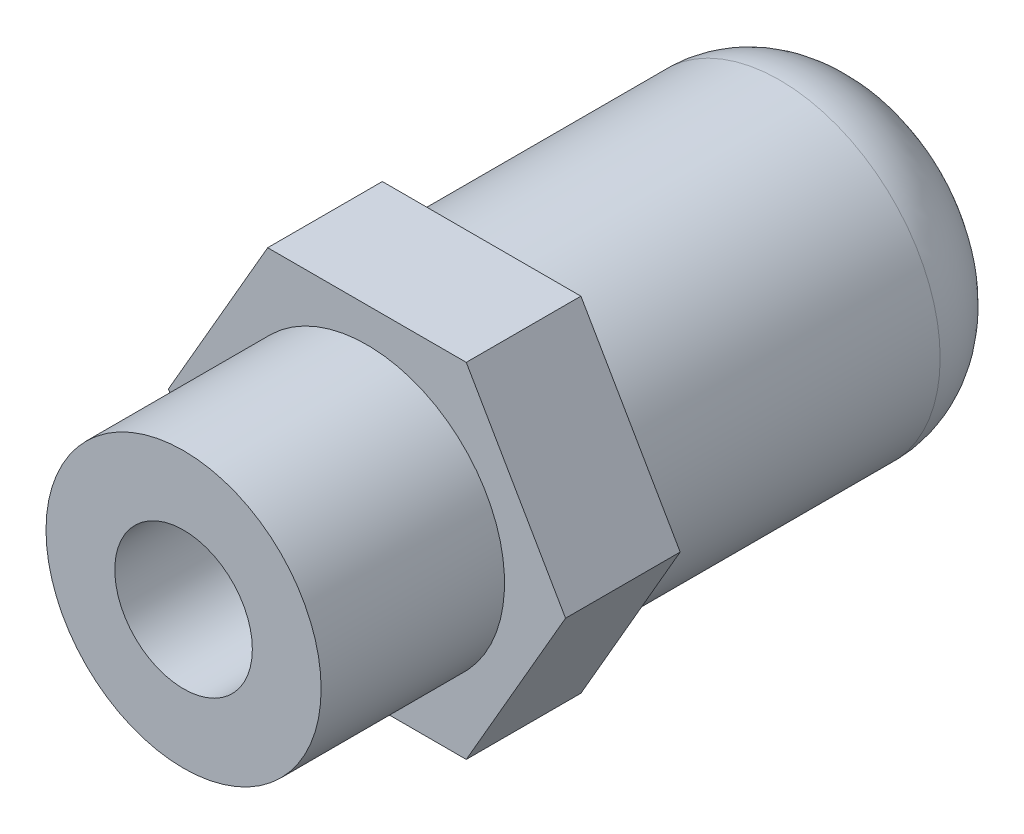
ISO-10303-21;
HEADER;
FILE_DESCRIPTION(('STEP AP214'),'2;1');
FILE_NAME('part.step','',(''),(''),'','','');
FILE_SCHEMA(('AUTOMOTIVE_DESIGN { 1 0 10303 214 1 1 1 1 }'));
ENDSEC;
DATA;
#1=APPLICATION_CONTEXT('core data for automotive mechanical design processes');
#2=APPLICATION_PROTOCOL_DEFINITION('international standard','automotive_design',2000,#1);
#3=PRODUCT_CONTEXT('',#1,'mechanical');
#4=PRODUCT('Part','Part','',(#3));
#5=PRODUCT_RELATED_PRODUCT_CATEGORY('part','',(#4));
#6=PRODUCT_DEFINITION_FORMATION('','',#4);
#7=PRODUCT_DEFINITION_CONTEXT('part definition',#1,'design');
#8=PRODUCT_DEFINITION('design','',#6,#7);
#9=PRODUCT_DEFINITION_SHAPE('','',#8);
#10=(LENGTH_UNIT() NAMED_UNIT(*) SI_UNIT(.MILLI.,.METRE.));
#11=(NAMED_UNIT(*) PLANE_ANGLE_UNIT() SI_UNIT($,.RADIAN.));
#12=(NAMED_UNIT(*) SI_UNIT($,.STERADIAN.) SOLID_ANGLE_UNIT());
#13=UNCERTAINTY_MEASURE_WITH_UNIT(LENGTH_MEASURE(1.E-05),#10,'distance_accuracy_value','');
#14=(GEOMETRIC_REPRESENTATION_CONTEXT(3) GLOBAL_UNCERTAINTY_ASSIGNED_CONTEXT((#13)) GLOBAL_UNIT_ASSIGNED_CONTEXT((#10,
#11,#12)) REPRESENTATION_CONTEXT('',''));
#15=CARTESIAN_POINT('',(0.,0.,0.));
#16=DIRECTION('',(0.,0.,1.));
#17=DIRECTION('',(1.,0.,0.));
#18=AXIS2_PLACEMENT_3D('',#15,#16,#17);
#19=CARTESIAN_POINT('',(0.,0.,8.));
#20=DIRECTION('',(0.,0.,-1.));
#21=DIRECTION('',(-1.,0.,0.));
#22=AXIS2_PLACEMENT_3D('',#19,#20,#21);
#23=CYLINDRICAL_SURFACE('',#22,6.);
#24=CARTESIAN_POINT('',(0.,0.,8.));
#25=DIRECTION('',(0.,0.,1.));
#26=DIRECTION('',(1.,0.,0.));
#27=AXIS2_PLACEMENT_3D('',#24,#25,#26);
#28=CIRCLE('',#27,6.);
#29=CARTESIAN_POINT('',(6.,0.,8.));
#30=VERTEX_POINT('',#29);
#31=EDGE_CURVE('E44',#30,#30,#28,.T.);
#32=ORIENTED_EDGE('',*,*,#31,.F.);
#33=EDGE_LOOP('',(#32));
#34=FACE_BOUND('',#33,.T.);
#35=CARTESIAN_POINT('',(0.,0.,0.));
#36=DIRECTION('',(0.,0.,-1.));
#37=DIRECTION('',(-1.,0.,0.));
#38=AXIS2_PLACEMENT_3D('',#35,#36,#37);
#39=CIRCLE('',#38,6.);
#40=CARTESIAN_POINT('',(-6.,0.,0.));
#41=VERTEX_POINT('',#40);
#42=EDGE_CURVE('E141',#41,#41,#39,.T.);
#43=ORIENTED_EDGE('',*,*,#42,.F.);
#44=EDGE_LOOP('',(#43));
#45=FACE_BOUND('',#44,.T.);
#46=ADVANCED_FACE('F35',(#34,#45),#23,.T.);
#47=CARTESIAN_POINT('',(0.,0.,8.));
#48=DIRECTION('',(0.,0.,1.));
#49=DIRECTION('',(1.,0.,0.));
#50=AXIS2_PLACEMENT_3D('',#47,#48,#49);
#51=PLANE('',#50);
#52=CARTESIAN_POINT('',(0.,0.,8.));
#53=DIRECTION('',(0.,0.,1.));
#54=DIRECTION('',(1.,0.,0.));
#55=AXIS2_PLACEMENT_3D('',#52,#53,#54);
#56=CIRCLE('',#55,3.);
#57=CARTESIAN_POINT('',(3.,0.,8.));
#58=VERTEX_POINT('',#57);
#59=EDGE_CURVE('E191',#58,#58,#56,.T.);
#60=ORIENTED_EDGE('',*,*,#59,.F.);
#61=EDGE_LOOP('',(#60));
#62=FACE_BOUND('',#61,.T.);
#63=ORIENTED_EDGE('',*,*,#31,.T.);
#64=EDGE_LOOP('',(#63));
#65=FACE_BOUND('',#64,.T.);
#66=ADVANCED_FACE('F146',(#62,#65),#51,.T.);
#67=CARTESIAN_POINT('',(4.33012701892219,-7.49999999999999,-5.));
#68=DIRECTION('',(0.,1.,0.));
#69=DIRECTION('',(-1.,0.,0.));
#70=AXIS2_PLACEMENT_3D('',#67,#68,#69);
#71=PLANE('',#70);
#72=DIRECTION('',(-1.,0.,0.));
#73=VECTOR('',#72,1.);
#74=CARTESIAN_POINT('',(4.33012701892219,-7.49999999999999,0.));
#75=LINE('',#74,#73);
#76=CARTESIAN_POINT('',(4.33012701892219,-7.49999999999999,0.));
#77=VERTEX_POINT('',#76);
#78=CARTESIAN_POINT('',(-4.33012701892219,-7.49999999999999,0.));
#79=VERTEX_POINT('',#78);
#80=EDGE_CURVE('E121',#77,#79,#75,.T.);
#81=ORIENTED_EDGE('',*,*,#80,.T.);
#82=DIRECTION('',(0.,0.,1.));
#83=VECTOR('',#82,1.);
#84=CARTESIAN_POINT('',(-4.33012701892219,-7.49999999999999,-5.));
#85=LINE('',#84,#83);
#86=CARTESIAN_POINT('',(-4.33012701892219,-7.49999999999999,-5.));
#87=VERTEX_POINT('',#86);
#88=EDGE_CURVE('E139',#87,#79,#85,.T.);
#89=ORIENTED_EDGE('',*,*,#88,.F.);
#90=DIRECTION('',(-1.,0.,0.));
#91=VECTOR('',#90,1.);
#92=CARTESIAN_POINT('',(4.33012701892219,-7.49999999999999,-5.));
#93=LINE('',#92,#91);
#94=CARTESIAN_POINT('',(4.33012701892219,-7.49999999999999,-5.));
#95=VERTEX_POINT('',#94);
#96=EDGE_CURVE('E132',#95,#87,#93,.T.);
#97=ORIENTED_EDGE('',*,*,#96,.F.);
#98=DIRECTION('',(0.,0.,1.));
#99=VECTOR('',#98,1.);
#100=CARTESIAN_POINT('',(4.33012701892219,-7.49999999999999,-5.));
#101=LINE('',#100,#99);
#102=EDGE_CURVE('E117',#95,#77,#101,.T.);
#103=ORIENTED_EDGE('',*,*,#102,.T.);
#104=EDGE_LOOP('',(#81,#89,#97,#103));
#105=FACE_BOUND('',#104,.T.);
#106=ADVANCED_FACE('F161',(#105),#71,.F.);
#107=CARTESIAN_POINT('',(-4.33012701892219,-7.49999999999999,-5.));
#108=DIRECTION('',(0.866025403784439,0.5,0.));
#109=DIRECTION('',(-0.5,0.866025403784439,0.));
#110=AXIS2_PLACEMENT_3D('',#107,#108,#109);
#111=PLANE('',#110);
#112=DIRECTION('',(-0.5,0.866025403784439,0.));
#113=VECTOR('',#112,1.);
#114=CARTESIAN_POINT('',(-4.33012701892219,-7.49999999999999,0.));
#115=LINE('',#114,#113);
#116=CARTESIAN_POINT('',(-8.66025403784438,0.,0.));
#117=VERTEX_POINT('',#116);
#118=EDGE_CURVE('E124',#79,#117,#115,.T.);
#119=ORIENTED_EDGE('',*,*,#118,.T.);
#120=DIRECTION('',(0.,0.,1.));
#121=VECTOR('',#120,1.);
#122=CARTESIAN_POINT('',(-8.66025403784438,0.,-5.));
#123=LINE('',#122,#121);
#124=CARTESIAN_POINT('',(-8.66025403784438,0.,-5.));
#125=VERTEX_POINT('',#124);
#126=EDGE_CURVE('E136',#125,#117,#123,.T.);
#127=ORIENTED_EDGE('',*,*,#126,.F.);
#128=DIRECTION('',(-0.5,0.866025403784439,0.));
#129=VECTOR('',#128,1.);
#130=CARTESIAN_POINT('',(-4.33012701892219,-7.49999999999999,-5.));
#131=LINE('',#130,#129);
#132=EDGE_CURVE('E90',#87,#125,#131,.T.);
#133=ORIENTED_EDGE('',*,*,#132,.F.);
#134=ORIENTED_EDGE('',*,*,#88,.T.);
#135=EDGE_LOOP('',(#119,#127,#133,#134));
#136=FACE_BOUND('',#135,.T.);
#137=ADVANCED_FACE('F179',(#136),#111,.F.);
#138=CARTESIAN_POINT('',(-8.66025403784438,0.,-5.));
#139=DIRECTION('',(0.866025403784438,-0.5,0.));
#140=DIRECTION('',(0.5,0.866025403784438,0.));
#141=AXIS2_PLACEMENT_3D('',#138,#139,#140);
#142=PLANE('',#141);
#143=DIRECTION('',(0.5,0.866025403784438,0.));
#144=VECTOR('',#143,1.);
#145=CARTESIAN_POINT('',(-8.66025403784438,0.,0.));
#146=LINE('',#145,#144);
#147=CARTESIAN_POINT('',(-4.33012701892219,7.5,0.));
#148=VERTEX_POINT('',#147);
#149=EDGE_CURVE('E127',#117,#148,#146,.T.);
#150=ORIENTED_EDGE('',*,*,#149,.T.);
#151=DIRECTION('',(0.,0.,1.));
#152=VECTOR('',#151,1.);
#153=CARTESIAN_POINT('',(-4.33012701892219,7.5,-5.));
#154=LINE('',#153,#152);
#155=CARTESIAN_POINT('',(-4.33012701892219,7.5,-5.));
#156=VERTEX_POINT('',#155);
#157=EDGE_CURVE('E112',#156,#148,#154,.T.);
#158=ORIENTED_EDGE('',*,*,#157,.F.);
#159=DIRECTION('',(0.5,0.866025403784438,0.));
#160=VECTOR('',#159,1.);
#161=CARTESIAN_POINT('',(-8.66025403784438,0.,-5.));
#162=LINE('',#161,#160);
#163=EDGE_CURVE('E103',#125,#156,#162,.T.);
#164=ORIENTED_EDGE('',*,*,#163,.F.);
#165=ORIENTED_EDGE('',*,*,#126,.T.);
#166=EDGE_LOOP('',(#150,#158,#164,#165));
#167=FACE_BOUND('',#166,.T.);
#168=ADVANCED_FACE('F176',(#167),#142,.F.);
#169=CARTESIAN_POINT('',(-4.33012701892219,7.5,-5.));
#170=DIRECTION('',(0.,-1.,0.));
#171=DIRECTION('',(1.,0.,0.));
#172=AXIS2_PLACEMENT_3D('',#169,#170,#171);
#173=PLANE('',#172);
#174=DIRECTION('',(1.,0.,0.));
#175=VECTOR('',#174,1.);
#176=CARTESIAN_POINT('',(-4.33012701892219,7.5,0.));
#177=LINE('',#176,#175);
#178=CARTESIAN_POINT('',(4.33012701892219,7.5,0.));
#179=VERTEX_POINT('',#178);
#180=EDGE_CURVE('E111',#148,#179,#177,.T.);
#181=ORIENTED_EDGE('',*,*,#180,.T.);
#182=DIRECTION('',(0.,0.,1.));
#183=VECTOR('',#182,1.);
#184=CARTESIAN_POINT('',(4.33012701892219,7.5,-5.));
#185=LINE('',#184,#183);
#186=CARTESIAN_POINT('',(4.33012701892219,7.5,-5.));
#187=VERTEX_POINT('',#186);
#188=EDGE_CURVE('E108',#187,#179,#185,.T.);
#189=ORIENTED_EDGE('',*,*,#188,.F.);
#190=DIRECTION('',(1.,0.,0.));
#191=VECTOR('',#190,1.);
#192=CARTESIAN_POINT('',(-4.33012701892219,7.5,-5.));
#193=LINE('',#192,#191);
#194=EDGE_CURVE('E97',#156,#187,#193,.T.);
#195=ORIENTED_EDGE('',*,*,#194,.F.);
#196=ORIENTED_EDGE('',*,*,#157,.T.);
#197=EDGE_LOOP('',(#181,#189,#195,#196));
#198=FACE_BOUND('',#197,.T.);
#199=ADVANCED_FACE('F109',(#198),#173,.F.);
#200=CARTESIAN_POINT('',(4.33012701892219,7.5,-5.));
#201=DIRECTION('',(-0.866025403784439,-0.5,0.));
#202=DIRECTION('',(0.5,-0.866025403784439,0.));
#203=AXIS2_PLACEMENT_3D('',#200,#201,#202);
#204=PLANE('',#203);
#205=DIRECTION('',(0.5,-0.866025403784439,0.));
#206=VECTOR('',#205,1.);
#207=CARTESIAN_POINT('',(4.33012701892219,7.5,0.));
#208=LINE('',#207,#206);
#209=CARTESIAN_POINT('',(8.66025403784439,0.,0.));
#210=VERTEX_POINT('',#209);
#211=EDGE_CURVE('E75',#179,#210,#208,.T.);
#212=ORIENTED_EDGE('',*,*,#211,.T.);
#213=DIRECTION('',(0.,0.,1.));
#214=VECTOR('',#213,1.);
#215=CARTESIAN_POINT('',(8.66025403784439,0.,-5.));
#216=LINE('',#215,#214);
#217=CARTESIAN_POINT('',(8.66025403784439,0.,-5.));
#218=VERTEX_POINT('',#217);
#219=EDGE_CURVE('E113',#218,#210,#216,.T.);
#220=ORIENTED_EDGE('',*,*,#219,.F.);
#221=DIRECTION('',(0.5,-0.866025403784439,0.));
#222=VECTOR('',#221,1.);
#223=CARTESIAN_POINT('',(4.33012701892219,7.5,-5.));
#224=LINE('',#223,#222);
#225=EDGE_CURVE('E101',#187,#218,#224,.T.);
#226=ORIENTED_EDGE('',*,*,#225,.F.);
#227=ORIENTED_EDGE('',*,*,#188,.T.);
#228=EDGE_LOOP('',(#212,#220,#226,#227));
#229=FACE_BOUND('',#228,.T.);
#230=ADVANCED_FACE('F115',(#229),#204,.F.);
#231=CARTESIAN_POINT('',(8.66025403784439,0.,-5.));
#232=DIRECTION('',(-0.866025403784438,0.5,0.));
#233=DIRECTION('',(-0.5,-0.866025403784439,0.));
#234=AXIS2_PLACEMENT_3D('',#231,#232,#233);
#235=PLANE('',#234);
#236=DIRECTION('',(-0.5,-0.866025403784438,0.));
#237=VECTOR('',#236,1.);
#238=CARTESIAN_POINT('',(8.66025403784439,0.,0.));
#239=LINE('',#238,#237);
#240=EDGE_CURVE('E81',#210,#77,#239,.T.);
#241=ORIENTED_EDGE('',*,*,#240,.T.);
#242=ORIENTED_EDGE('',*,*,#102,.F.);
#243=DIRECTION('',(-0.5,-0.866025403784438,0.));
#244=VECTOR('',#243,1.);
#245=CARTESIAN_POINT('',(8.66025403784439,0.,-5.));
#246=LINE('',#245,#244);
#247=EDGE_CURVE('E52',#218,#95,#246,.T.);
#248=ORIENTED_EDGE('',*,*,#247,.F.);
#249=ORIENTED_EDGE('',*,*,#219,.T.);
#250=EDGE_LOOP('',(#241,#242,#248,#249));
#251=FACE_BOUND('',#250,.T.);
#252=ADVANCED_FACE('F163',(#251),#235,.F.);
#253=CARTESIAN_POINT('',(0.,0.,-5.));
#254=DIRECTION('',(0.,0.,-1.));
#255=DIRECTION('',(-1.,0.,0.));
#256=AXIS2_PLACEMENT_3D('',#253,#254,#255);
#257=PLANE('',#256);
#258=CARTESIAN_POINT('',(0.,0.,-5.));
#259=DIRECTION('',(0.,0.,-1.));
#260=DIRECTION('',(-1.,0.,0.));
#261=AXIS2_PLACEMENT_3D('',#258,#259,#260);
#262=CIRCLE('',#261,7.);
#263=CARTESIAN_POINT('',(-7.,0.,-5.));
#264=VERTEX_POINT('',#263);
#265=EDGE_CURVE('E125',#264,#264,#262,.T.);
#266=ORIENTED_EDGE('',*,*,#265,.F.);
#267=EDGE_LOOP('',(#266));
#268=FACE_BOUND('',#267,.T.);
#269=ORIENTED_EDGE('',*,*,#96,.T.);
#270=ORIENTED_EDGE('',*,*,#132,.T.);
#271=ORIENTED_EDGE('',*,*,#163,.T.);
#272=ORIENTED_EDGE('',*,*,#194,.T.);
#273=ORIENTED_EDGE('',*,*,#225,.T.);
#274=ORIENTED_EDGE('',*,*,#247,.T.);
#275=EDGE_LOOP('',(#269,#270,#271,#272,#273,#274));
#276=FACE_BOUND('',#275,.T.);
#277=ADVANCED_FACE('F99',(#268,#276),#257,.T.);
#278=CARTESIAN_POINT('',(0.,0.,0.));
#279=DIRECTION('',(0.,0.,-1.));
#280=DIRECTION('',(-1.,0.,0.));
#281=AXIS2_PLACEMENT_3D('',#278,#279,#280);
#282=PLANE('',#281);
#283=ORIENTED_EDGE('',*,*,#42,.T.);
#284=EDGE_LOOP('',(#283));
#285=FACE_BOUND('',#284,.T.);
#286=ORIENTED_EDGE('',*,*,#80,.F.);
#287=ORIENTED_EDGE('',*,*,#240,.F.);
#288=ORIENTED_EDGE('',*,*,#211,.F.);
#289=ORIENTED_EDGE('',*,*,#180,.F.);
#290=ORIENTED_EDGE('',*,*,#149,.F.);
#291=ORIENTED_EDGE('',*,*,#118,.F.);
#292=EDGE_LOOP('',(#286,#287,#288,#289,#290,#291));
#293=FACE_BOUND('',#292,.T.);
#294=ADVANCED_FACE('F152',(#285,#293),#282,.F.);
#295=CARTESIAN_POINT('',(0.,0.,-22.));
#296=DIRECTION('',(0.,0.,1.));
#297=DIRECTION('',(1.,0.,0.));
#298=AXIS2_PLACEMENT_3D('',#295,#296,#297);
#299=CYLINDRICAL_SURFACE('',#298,7.);
#300=CARTESIAN_POINT('',(0.,0.,-18.));
#301=DIRECTION('',(0.,0.,-1.));
#302=DIRECTION('',(-1.,0.,0.));
#303=AXIS2_PLACEMENT_3D('',#300,#301,#302);
#304=CIRCLE('',#303,7.);
#305=CARTESIAN_POINT('',(-7.,0.,-18.));
#306=VERTEX_POINT('',#305);
#307=EDGE_CURVE('E11',#306,#306,#304,.F.);
#308=ORIENTED_EDGE('',*,*,#307,.T.);
#309=EDGE_LOOP('',(#308));
#310=FACE_BOUND('',#309,.T.);
#311=ORIENTED_EDGE('',*,*,#265,.T.);
#312=EDGE_LOOP('',(#311));
#313=FACE_BOUND('',#312,.T.);
#314=ADVANCED_FACE('F155',(#310,#313),#299,.T.);
#315=CARTESIAN_POINT('',(0.,0.,-18.));
#316=DIRECTION('',(0.,0.,-1.));
#317=DIRECTION('',(-1.,0.,0.));
#318=AXIS2_PLACEMENT_3D('',#315,#316,#317);
#319=DEGENERATE_TOROIDAL_SURFACE('',#318,3.,4.,.T.);
#320=ORIENTED_EDGE('',*,*,#307,.F.);
#321=EDGE_LOOP('',(#320));
#322=FACE_BOUND('',#321,.T.);
#323=CARTESIAN_POINT('',(0.,0.,-22.));
#324=DIRECTION('',(0.,0.,1.));
#325=DIRECTION('',(1.,0.,0.));
#326=AXIS2_PLACEMENT_3D('',#323,#324,#325);
#327=CIRCLE('',#326,3.);
#328=CARTESIAN_POINT('',(3.,0.,-22.));
#329=VERTEX_POINT('',#328);
#330=EDGE_CURVE('E193',#329,#329,#327,.T.);
#331=ORIENTED_EDGE('',*,*,#330,.T.);
#332=EDGE_LOOP('',(#331));
#333=FACE_BOUND('',#332,.T.);
#334=ADVANCED_FACE('F37',(#322,#333),#319,.T.);
#335=CARTESIAN_POINT('',(0.,0.,-22.));
#336=DIRECTION('',(0.,0.,1.));
#337=DIRECTION('',(1.,0.,0.));
#338=AXIS2_PLACEMENT_3D('',#335,#336,#337);
#339=CYLINDRICAL_SURFACE('',#338,3.);
#340=CARTESIAN_POINT('',(3.,0.,-22.));
#341=CARTESIAN_POINT('',(3.,0.,-21.6875));
#342=CARTESIAN_POINT('',(3.,0.,-21.375));
#343=CARTESIAN_POINT('',(3.,0.,-20.75));
#344=CARTESIAN_POINT('',(3.,0.,-20.4375));
#345=CARTESIAN_POINT('',(3.,0.,-19.8125));
#346=CARTESIAN_POINT('',(3.,0.,-19.5));
#347=CARTESIAN_POINT('',(3.,0.,-18.875));
#348=CARTESIAN_POINT('',(3.,0.,-18.5625));
#349=CARTESIAN_POINT('',(3.,0.,-17.9375));
#350=CARTESIAN_POINT('',(3.,0.,-17.625));
#351=CARTESIAN_POINT('',(3.,0.,-17.));
#352=CARTESIAN_POINT('',(3.,0.,-16.6875));
#353=CARTESIAN_POINT('',(3.,0.,-16.0625));
#354=CARTESIAN_POINT('',(3.,0.,-15.75));
#355=CARTESIAN_POINT('',(3.,0.,-15.125));
#356=CARTESIAN_POINT('',(3.,0.,-14.8125));
#357=CARTESIAN_POINT('',(3.,0.,-14.1875));
#358=CARTESIAN_POINT('',(3.,0.,-13.875));
#359=CARTESIAN_POINT('',(3.,0.,-13.25));
#360=CARTESIAN_POINT('',(3.,0.,-12.9375));
#361=CARTESIAN_POINT('',(3.,0.,-12.3125));
#362=CARTESIAN_POINT('',(3.,0.,-12.));
#363=CARTESIAN_POINT('',(3.,0.,-11.375));
#364=CARTESIAN_POINT('',(3.,0.,-11.0625));
#365=CARTESIAN_POINT('',(3.,0.,-10.4375));
#366=CARTESIAN_POINT('',(3.,0.,-10.125));
#367=CARTESIAN_POINT('',(3.,0.,-9.5));
#368=CARTESIAN_POINT('',(3.,0.,-9.1875));
#369=CARTESIAN_POINT('',(3.,0.,-8.5625));
#370=CARTESIAN_POINT('',(3.,0.,-8.25));
#371=CARTESIAN_POINT('',(3.,0.,-7.625));
#372=CARTESIAN_POINT('',(3.,0.,-7.3125));
#373=CARTESIAN_POINT('',(3.,0.,-6.6875));
#374=CARTESIAN_POINT('',(3.,0.,-6.375));
#375=CARTESIAN_POINT('',(3.,0.,-5.75000000000001));
#376=CARTESIAN_POINT('',(3.,0.,-5.4375));
#377=CARTESIAN_POINT('',(3.,0.,-4.8125));
#378=CARTESIAN_POINT('',(3.,0.,-4.5));
#379=CARTESIAN_POINT('',(3.,0.,-3.875));
#380=CARTESIAN_POINT('',(3.,0.,-3.5625));
#381=CARTESIAN_POINT('',(3.,0.,-2.9375));
#382=CARTESIAN_POINT('',(3.,0.,-2.625));
#383=CARTESIAN_POINT('',(3.,0.,-2.));
#384=CARTESIAN_POINT('',(3.,0.,-1.6875));
#385=CARTESIAN_POINT('',(3.,0.,-1.0625));
#386=CARTESIAN_POINT('',(3.,0.,-0.750000000000003));
#387=CARTESIAN_POINT('',(3.,0.,-0.125000000000004));
#388=CARTESIAN_POINT('',(3.,0.,0.187499999999997));
#389=CARTESIAN_POINT('',(3.,0.,0.812499999999997));
#390=CARTESIAN_POINT('',(3.,0.,1.125));
#391=CARTESIAN_POINT('',(3.,0.,1.75));
#392=CARTESIAN_POINT('',(3.,0.,2.0625));
#393=CARTESIAN_POINT('',(3.,0.,2.6875));
#394=CARTESIAN_POINT('',(3.,0.,3.));
#395=CARTESIAN_POINT('',(3.,0.,3.625));
#396=CARTESIAN_POINT('',(3.,0.,3.9375));
#397=CARTESIAN_POINT('',(3.,0.,4.5625));
#398=CARTESIAN_POINT('',(3.,0.,4.875));
#399=CARTESIAN_POINT('',(3.,0.,5.5));
#400=CARTESIAN_POINT('',(3.,0.,5.8125));
#401=CARTESIAN_POINT('',(3.,0.,6.4375));
#402=CARTESIAN_POINT('',(3.,0.,6.75));
#403=CARTESIAN_POINT('',(3.,0.,7.375));
#404=CARTESIAN_POINT('',(3.,0.,7.6875));
#405=CARTESIAN_POINT('',(3.,0.,8.));
#406=B_SPLINE_CURVE_WITH_KNOTS('',3,(#340,#341,#342,#343,#344,#345,#346,#347,#348,#349,#350,
#351,#352,#353,#354,#355,#356,#357,#358,#359,#360,#361,#362,#363,#364,#365,#366,#367,#368,#369,
#370,#371,#372,#373,#374,#375,#376,#377,#378,#379,#380,#381,#382,#383,#384,#385,#386,#387,#388,
#389,#390,#391,#392,#393,#394,#395,#396,#397,#398,#399,#400,#401,#402,#403,#404,#405),
.UNSPECIFIED.,.F.,.F.,(4,2,2,2,2,2,2,2,2,2,2,2,2,2,2,2,2,2,2,2,2,2,2,2,2,2,2,2,2,2,2,2,4),(0.,
0.937500000000001,1.875,2.8125,3.75,4.6875,5.625,6.5625,7.5,8.4375,9.375,10.3125,11.25,12.1875,
13.125,14.0625,15.,15.9375,16.875,17.8125,18.75,19.6875,20.625,21.5625,22.5,23.4375,24.375,
25.3125,26.25,27.1875,28.125,29.0625,30.),.UNSPECIFIED.);
#407=EDGE_CURVE('BSEAM209',#329,#58,#406,.T.);
#408=ORIENTED_EDGE('',*,*,#330,.F.);
#409=ORIENTED_EDGE('',*,*,#59,.T.);
#410=ORIENTED_EDGE('',*,*,#407,.T.);
#411=ORIENTED_EDGE('',*,*,#407,.F.);
#412=EDGE_LOOP('',(#408,#410,#409,#411));
#413=FACE_BOUND('',#412,.T.);
#414=ADVANCED_FACE('F209',(#413),#339,.F.);
#415=CLOSED_SHELL('',(#46,#66,#106,#137,#168,#199,#230,#252,#277,#294,#314,#334,#414));
#416=MANIFOLD_SOLID_BREP('B2',#415);
#417=ADVANCED_BREP_SHAPE_REPRESENTATION('',(#18,#416),#14);
#418=SHAPE_DEFINITION_REPRESENTATION(#9,#417);
ENDSEC;
END-ISO-10303-21;
